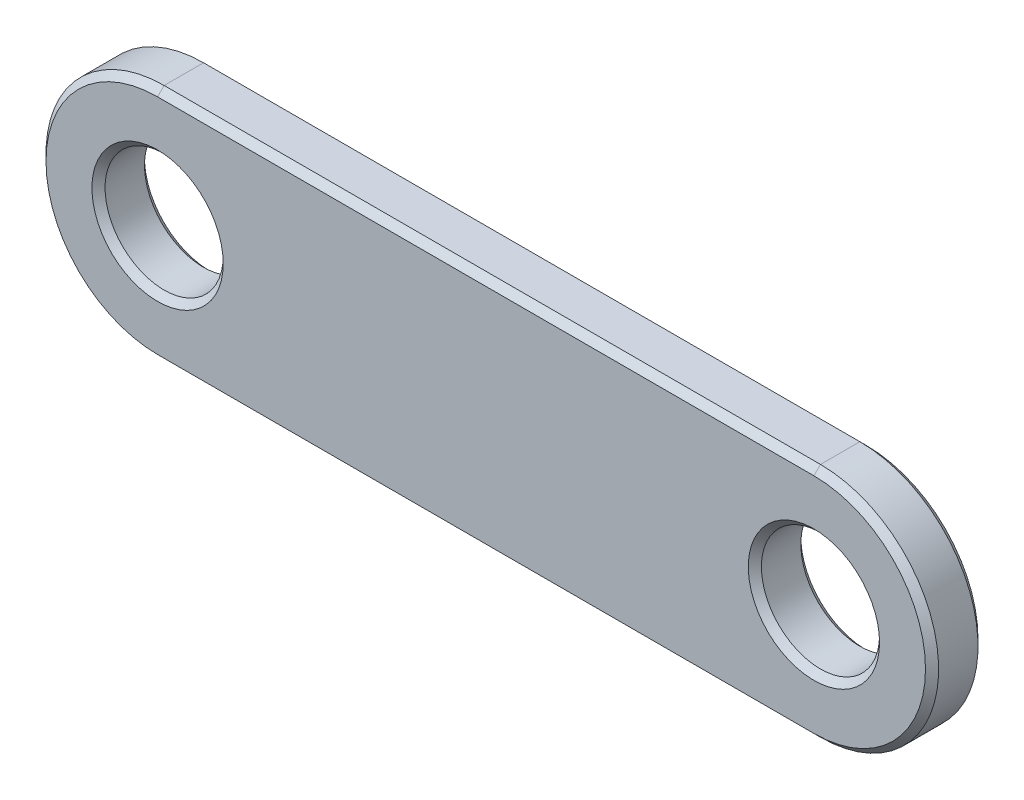
ISO-10303-21;
HEADER;
FILE_DESCRIPTION(('STEP AP214'),'2;1');
FILE_NAME('part.step','',(''),(''),'','','');
FILE_SCHEMA(('AUTOMOTIVE_DESIGN { 1 0 10303 214 1 1 1 1 }'));
ENDSEC;
DATA;
#1=APPLICATION_CONTEXT('core data for automotive mechanical design processes');
#2=APPLICATION_PROTOCOL_DEFINITION('international standard','automotive_design',2000,#1);
#3=PRODUCT_CONTEXT('',#1,'mechanical');
#4=PRODUCT('Part','Part','',(#3));
#5=PRODUCT_RELATED_PRODUCT_CATEGORY('part','',(#4));
#6=PRODUCT_DEFINITION_FORMATION('','',#4);
#7=PRODUCT_DEFINITION_CONTEXT('part definition',#1,'design');
#8=PRODUCT_DEFINITION('design','',#6,#7);
#9=PRODUCT_DEFINITION_SHAPE('','',#8);
#10=(LENGTH_UNIT() NAMED_UNIT(*) SI_UNIT(.MILLI.,.METRE.));
#11=(NAMED_UNIT(*) PLANE_ANGLE_UNIT() SI_UNIT($,.RADIAN.));
#12=(NAMED_UNIT(*) SI_UNIT($,.STERADIAN.) SOLID_ANGLE_UNIT());
#13=UNCERTAINTY_MEASURE_WITH_UNIT(LENGTH_MEASURE(1.E-05),#10,'distance_accuracy_value','');
#14=(GEOMETRIC_REPRESENTATION_CONTEXT(3) GLOBAL_UNCERTAINTY_ASSIGNED_CONTEXT((#13)) GLOBAL_UNIT_ASSIGNED_CONTEXT((#10,
#11,#12)) REPRESENTATION_CONTEXT('',''));
#15=CARTESIAN_POINT('',(0.,0.,0.));
#16=DIRECTION('',(0.,0.,1.));
#17=DIRECTION('',(1.,0.,0.));
#18=AXIS2_PLACEMENT_3D('',#15,#16,#17);
#19=CARTESIAN_POINT('',(-63.5,0.,5.08));
#20=DIRECTION('',(0.,0.,1.));
#21=DIRECTION('',(1.,0.,0.));
#22=AXIS2_PLACEMENT_3D('',#19,#20,#21);
#23=PLANE('',#22);
#24=CARTESIAN_POINT('',(-63.5,0.,5.08));
#25=DIRECTION('',(0.,0.,1.));
#26=DIRECTION('',(1.,0.,0.));
#27=AXIS2_PLACEMENT_3D('',#24,#25,#26);
#28=CIRCLE('',#27,6.34999999999998);
#29=CARTESIAN_POINT('',(-57.15,0.,5.08));
#30=VERTEX_POINT('',#29);
#31=EDGE_CURVE('E11',#30,#30,#28,.F.);
#32=ORIENTED_EDGE('',*,*,#31,.T.);
#33=EDGE_LOOP('',(#32));
#34=FACE_BOUND('',#33,.T.);
#35=CARTESIAN_POINT('',(0.,0.,5.08));
#36=DIRECTION('',(0.,0.,1.));
#37=DIRECTION('',(1.,0.,0.));
#38=AXIS2_PLACEMENT_3D('',#35,#36,#37);
#39=CIRCLE('',#38,10.795);
#40=CARTESIAN_POINT('',(0.,-10.795,5.08));
#41=VERTEX_POINT('',#40);
#42=CARTESIAN_POINT('',(0.,10.795,5.08));
#43=VERTEX_POINT('',#42);
#44=EDGE_CURVE('E51',#41,#43,#39,.T.);
#45=ORIENTED_EDGE('',*,*,#44,.T.);
#46=DIRECTION('',(-1.,0.,0.));
#47=VECTOR('',#46,1.);
#48=CARTESIAN_POINT('',(-63.5,10.795,5.08));
#49=LINE('',#48,#47);
#50=CARTESIAN_POINT('',(-63.5,10.795,5.08));
#51=VERTEX_POINT('',#50);
#52=EDGE_CURVE('E43',#43,#51,#49,.T.);
#53=ORIENTED_EDGE('',*,*,#52,.T.);
#54=CARTESIAN_POINT('',(-63.5,0.,5.08));
#55=DIRECTION('',(0.,0.,1.));
#56=DIRECTION('',(1.,0.,0.));
#57=AXIS2_PLACEMENT_3D('',#54,#55,#56);
#58=CIRCLE('',#57,10.795);
#59=CARTESIAN_POINT('',(-63.5,-10.795,5.08));
#60=VERTEX_POINT('',#59);
#61=EDGE_CURVE('E169',#51,#60,#58,.T.);
#62=ORIENTED_EDGE('',*,*,#61,.T.);
#63=DIRECTION('',(1.,0.,0.));
#64=VECTOR('',#63,1.);
#65=CARTESIAN_POINT('',(0.,-10.795,5.08));
#66=LINE('',#65,#64);
#67=EDGE_CURVE('E56',#60,#41,#66,.T.);
#68=ORIENTED_EDGE('',*,*,#67,.T.);
#69=EDGE_LOOP('',(#45,#53,#62,#68));
#70=FACE_BOUND('',#69,.T.);
#71=CARTESIAN_POINT('',(0.,0.,5.08));
#72=DIRECTION('',(0.,0.,1.));
#73=DIRECTION('',(1.,0.,0.));
#74=AXIS2_PLACEMENT_3D('',#71,#72,#73);
#75=CIRCLE('',#74,6.34999999999998);
#76=CARTESIAN_POINT('',(6.34999999999998,0.,5.08));
#77=VERTEX_POINT('',#76);
#78=EDGE_CURVE('E166',#77,#77,#75,.F.);
#79=ORIENTED_EDGE('',*,*,#78,.T.);
#80=EDGE_LOOP('',(#79));
#81=FACE_BOUND('',#80,.T.);
#82=ADVANCED_FACE('F34',(#34,#70,#81),#23,.T.);
#83=CARTESIAN_POINT('',(-63.5,0.,0.));
#84=DIRECTION('',(0.,0.,1.));
#85=DIRECTION('',(1.,0.,0.));
#86=AXIS2_PLACEMENT_3D('',#83,#84,#85);
#87=PLANE('',#86);
#88=CARTESIAN_POINT('',(-63.5,0.,0.));
#89=DIRECTION('',(0.,0.,1.));
#90=DIRECTION('',(1.,0.,0.));
#91=AXIS2_PLACEMENT_3D('',#88,#89,#90);
#92=CIRCLE('',#91,6.34999999999999);
#93=CARTESIAN_POINT('',(-57.15,0.,0.));
#94=VERTEX_POINT('',#93);
#95=EDGE_CURVE('E131',#94,#94,#92,.T.);
#96=ORIENTED_EDGE('',*,*,#95,.T.);
#97=EDGE_LOOP('',(#96));
#98=FACE_BOUND('',#97,.T.);
#99=CARTESIAN_POINT('',(0.,0.,0.));
#100=DIRECTION('',(0.,0.,1.));
#101=DIRECTION('',(1.,0.,0.));
#102=AXIS2_PLACEMENT_3D('',#99,#100,#101);
#103=CIRCLE('',#102,6.35);
#104=CARTESIAN_POINT('',(6.35,0.,0.));
#105=VERTEX_POINT('',#104);
#106=EDGE_CURVE('E128',#105,#105,#103,.T.);
#107=ORIENTED_EDGE('',*,*,#106,.T.);
#108=EDGE_LOOP('',(#107));
#109=FACE_BOUND('',#108,.T.);
#110=CARTESIAN_POINT('',(0.,0.,0.));
#111=DIRECTION('',(0.,0.,1.));
#112=DIRECTION('',(1.,0.,0.));
#113=AXIS2_PLACEMENT_3D('',#110,#111,#112);
#114=CIRCLE('',#113,10.795);
#115=CARTESIAN_POINT('',(0.,10.795,0.));
#116=VERTEX_POINT('',#115);
#117=CARTESIAN_POINT('',(0.,-10.795,0.));
#118=VERTEX_POINT('',#117);
#119=EDGE_CURVE('E127',#116,#118,#114,.F.);
#120=ORIENTED_EDGE('',*,*,#119,.T.);
#121=DIRECTION('',(-1.,0.,0.));
#122=VECTOR('',#121,1.);
#123=CARTESIAN_POINT('',(-63.5,-10.795,0.));
#124=LINE('',#123,#122);
#125=CARTESIAN_POINT('',(-63.5,-10.795,0.));
#126=VERTEX_POINT('',#125);
#127=EDGE_CURVE('E106',#118,#126,#124,.T.);
#128=ORIENTED_EDGE('',*,*,#127,.T.);
#129=CARTESIAN_POINT('',(-63.5,0.,0.));
#130=DIRECTION('',(0.,0.,1.));
#131=DIRECTION('',(1.,0.,0.));
#132=AXIS2_PLACEMENT_3D('',#129,#130,#131);
#133=CIRCLE('',#132,10.795);
#134=CARTESIAN_POINT('',(-63.5,10.795,0.));
#135=VERTEX_POINT('',#134);
#136=EDGE_CURVE('E116',#126,#135,#133,.F.);
#137=ORIENTED_EDGE('',*,*,#136,.T.);
#138=DIRECTION('',(1.,0.,0.));
#139=VECTOR('',#138,1.);
#140=CARTESIAN_POINT('',(-63.5,10.795,0.));
#141=LINE('',#140,#139);
#142=EDGE_CURVE('E122',#135,#116,#141,.T.);
#143=ORIENTED_EDGE('',*,*,#142,.T.);
#144=EDGE_LOOP('',(#120,#128,#137,#143));
#145=FACE_BOUND('',#144,.T.);
#146=ADVANCED_FACE('F125',(#98,#109,#145),#87,.F.);
#147=CARTESIAN_POINT('',(-63.5,0.,5.08));
#148=DIRECTION('',(0.,0.,-1.));
#149=DIRECTION('',(-1.,0.,0.));
#150=AXIS2_PLACEMENT_3D('',#147,#148,#149);
#151=CYLINDRICAL_SURFACE('',#150,11.43);
#152=DIRECTION('',(0.,0.,-1.));
#153=VECTOR('',#152,1.);
#154=CARTESIAN_POINT('',(-63.5,11.43,5.08));
#155=LINE('',#154,#153);
#156=CARTESIAN_POINT('',(-63.5,11.43,4.44500000000003));
#157=VERTEX_POINT('',#156);
#158=CARTESIAN_POINT('',(-63.5,11.43,0.635000000000009));
#159=VERTEX_POINT('',#158);
#160=EDGE_CURVE('E178',#157,#159,#155,.T.);
#161=ORIENTED_EDGE('',*,*,#160,.T.);
#162=CARTESIAN_POINT('',(-63.5,0.,0.635000000000009));
#163=DIRECTION('',(0.,0.,1.));
#164=DIRECTION('',(1.,0.,0.));
#165=AXIS2_PLACEMENT_3D('',#162,#163,#164);
#166=CIRCLE('',#165,11.43);
#167=CARTESIAN_POINT('',(-63.5,-11.43,0.635000000000009));
#168=VERTEX_POINT('',#167);
#169=EDGE_CURVE('E164',#159,#168,#166,.T.);
#170=ORIENTED_EDGE('',*,*,#169,.T.);
#171=DIRECTION('',(0.,0.,-1.));
#172=VECTOR('',#171,1.);
#173=CARTESIAN_POINT('',(-63.5,-11.43,5.08));
#174=LINE('',#173,#172);
#175=CARTESIAN_POINT('',(-63.5,-11.43,4.44500000000003));
#176=VERTEX_POINT('',#175);
#177=EDGE_CURVE('E123',#176,#168,#174,.T.);
#178=ORIENTED_EDGE('',*,*,#177,.F.);
#179=CARTESIAN_POINT('',(-63.5,0.,4.44500000000003));
#180=DIRECTION('',(0.,0.,1.));
#181=DIRECTION('',(1.,0.,0.));
#182=AXIS2_PLACEMENT_3D('',#179,#180,#181);
#183=CIRCLE('',#182,11.43);
#184=EDGE_CURVE('E162',#176,#157,#183,.F.);
#185=ORIENTED_EDGE('',*,*,#184,.T.);
#186=EDGE_LOOP('',(#161,#170,#178,#185));
#187=FACE_BOUND('',#186,.T.);
#188=ADVANCED_FACE('F204',(#187),#151,.T.);
#189=CARTESIAN_POINT('',(-63.5,-11.43,5.08));
#190=DIRECTION('',(0.,1.,0.));
#191=DIRECTION('',(0.,0.,1.));
#192=AXIS2_PLACEMENT_3D('',#189,#190,#191);
#193=PLANE('',#192);
#194=ORIENTED_EDGE('',*,*,#177,.T.);
#195=DIRECTION('',(1.,0.,0.));
#196=VECTOR('',#195,1.);
#197=CARTESIAN_POINT('',(-63.5,-11.43,0.635000000000009));
#198=LINE('',#197,#196);
#199=CARTESIAN_POINT('',(0.,-11.43,0.635000000000009));
#200=VERTEX_POINT('',#199);
#201=EDGE_CURVE('E109',#168,#200,#198,.T.);
#202=ORIENTED_EDGE('',*,*,#201,.T.);
#203=DIRECTION('',(0.,0.,-1.));
#204=VECTOR('',#203,1.);
#205=CARTESIAN_POINT('',(0.,-11.43,5.08));
#206=LINE('',#205,#204);
#207=CARTESIAN_POINT('',(0.,-11.43,4.44500000000003));
#208=VERTEX_POINT('',#207);
#209=EDGE_CURVE('E201',#208,#200,#206,.T.);
#210=ORIENTED_EDGE('',*,*,#209,.F.);
#211=DIRECTION('',(-1.,0.,0.));
#212=VECTOR('',#211,1.);
#213=CARTESIAN_POINT('',(-63.5,-11.43,4.44500000000003));
#214=LINE('',#213,#212);
#215=EDGE_CURVE('E150',#208,#176,#214,.T.);
#216=ORIENTED_EDGE('',*,*,#215,.T.);
#217=EDGE_LOOP('',(#194,#202,#210,#216));
#218=FACE_BOUND('',#217,.T.);
#219=ADVANCED_FACE('F199',(#218),#193,.F.);
#220=CARTESIAN_POINT('',(0.,0.,5.08));
#221=DIRECTION('',(0.,0.,-1.));
#222=DIRECTION('',(-1.,0.,0.));
#223=AXIS2_PLACEMENT_3D('',#220,#221,#222);
#224=CYLINDRICAL_SURFACE('',#223,11.43);
#225=ORIENTED_EDGE('',*,*,#209,.T.);
#226=CARTESIAN_POINT('',(0.,0.,0.635000000000009));
#227=DIRECTION('',(0.,0.,1.));
#228=DIRECTION('',(1.,0.,0.));
#229=AXIS2_PLACEMENT_3D('',#226,#227,#228);
#230=CIRCLE('',#229,11.43);
#231=CARTESIAN_POINT('',(0.,11.43,0.635000000000009));
#232=VERTEX_POINT('',#231);
#233=EDGE_CURVE('E155',#200,#232,#230,.T.);
#234=ORIENTED_EDGE('',*,*,#233,.T.);
#235=DIRECTION('',(0.,0.,-1.));
#236=VECTOR('',#235,1.);
#237=CARTESIAN_POINT('',(0.,11.43,5.08));
#238=LINE('',#237,#236);
#239=CARTESIAN_POINT('',(0.,11.43,4.44500000000003));
#240=VERTEX_POINT('',#239);
#241=EDGE_CURVE('E207',#240,#232,#238,.T.);
#242=ORIENTED_EDGE('',*,*,#241,.F.);
#243=CARTESIAN_POINT('',(0.,0.,4.44500000000003));
#244=DIRECTION('',(0.,0.,1.));
#245=DIRECTION('',(1.,0.,0.));
#246=AXIS2_PLACEMENT_3D('',#243,#244,#245);
#247=CIRCLE('',#246,11.43);
#248=EDGE_CURVE('E153',#240,#208,#247,.F.);
#249=ORIENTED_EDGE('',*,*,#248,.T.);
#250=EDGE_LOOP('',(#225,#234,#242,#249));
#251=FACE_BOUND('',#250,.T.);
#252=ADVANCED_FACE('F220',(#251),#224,.T.);
#253=CARTESIAN_POINT('',(-63.5,11.43,5.08));
#254=DIRECTION('',(0.,-1.,0.));
#255=DIRECTION('',(0.,0.,-1.));
#256=AXIS2_PLACEMENT_3D('',#253,#254,#255);
#257=PLANE('',#256);
#258=ORIENTED_EDGE('',*,*,#241,.T.);
#259=DIRECTION('',(-1.,0.,0.));
#260=VECTOR('',#259,1.);
#261=CARTESIAN_POINT('',(-63.5,11.43,0.635000000000009));
#262=LINE('',#261,#260);
#263=EDGE_CURVE('E160',#232,#159,#262,.T.);
#264=ORIENTED_EDGE('',*,*,#263,.T.);
#265=ORIENTED_EDGE('',*,*,#160,.F.);
#266=DIRECTION('',(1.,0.,0.));
#267=VECTOR('',#266,1.);
#268=CARTESIAN_POINT('',(0.,11.43,4.44500000000003));
#269=LINE('',#268,#267);
#270=EDGE_CURVE('E157',#157,#240,#269,.T.);
#271=ORIENTED_EDGE('',*,*,#270,.T.);
#272=EDGE_LOOP('',(#258,#264,#265,#271));
#273=FACE_BOUND('',#272,.T.);
#274=ADVANCED_FACE('F224',(#273),#257,.F.);
#275=CARTESIAN_POINT('',(0.,0.,5.08));
#276=DIRECTION('',(0.,0.,-1.));
#277=DIRECTION('',(-1.,0.,0.));
#278=AXIS2_PLACEMENT_3D('',#275,#276,#277);
#279=CYLINDRICAL_SURFACE('',#278,5.715);
#280=CARTESIAN_POINT('',(0.,0.,0.635000000000004));
#281=DIRECTION('',(0.,0.,1.));
#282=DIRECTION('',(1.,0.,0.));
#283=AXIS2_PLACEMENT_3D('',#280,#281,#282);
#284=CIRCLE('',#283,5.715);
#285=CARTESIAN_POINT('',(5.715,0.,0.635000000000004));
#286=VERTEX_POINT('',#285);
#287=EDGE_CURVE('E147',#286,#286,#284,.F.);
#288=ORIENTED_EDGE('',*,*,#287,.T.);
#289=EDGE_LOOP('',(#288));
#290=FACE_BOUND('',#289,.T.);
#291=CARTESIAN_POINT('',(0.,0.,4.44500000000002));
#292=DIRECTION('',(0.,0.,1.));
#293=DIRECTION('',(1.,0.,0.));
#294=AXIS2_PLACEMENT_3D('',#291,#292,#293);
#295=CIRCLE('',#294,5.715);
#296=CARTESIAN_POINT('',(5.715,0.,4.44500000000002));
#297=VERTEX_POINT('',#296);
#298=EDGE_CURVE('E144',#297,#297,#295,.T.);
#299=ORIENTED_EDGE('',*,*,#298,.T.);
#300=EDGE_LOOP('',(#299));
#301=FACE_BOUND('',#300,.T.);
#302=ADVANCED_FACE('F240',(#290,#301),#279,.F.);
#303=CARTESIAN_POINT('',(-63.5,0.,5.08));
#304=DIRECTION('',(0.,0.,-1.));
#305=DIRECTION('',(-1.,0.,0.));
#306=AXIS2_PLACEMENT_3D('',#303,#304,#305);
#307=CYLINDRICAL_SURFACE('',#306,5.71500000000001);
#308=CARTESIAN_POINT('',(-63.5,0.,0.634999999999985));
#309=DIRECTION('',(0.,0.,1.));
#310=DIRECTION('',(1.,0.,0.));
#311=AXIS2_PLACEMENT_3D('',#308,#309,#310);
#312=CIRCLE('',#311,5.71500000000001);
#313=CARTESIAN_POINT('',(-57.785,0.,0.634999999999985));
#314=VERTEX_POINT('',#313);
#315=EDGE_CURVE('E141',#314,#314,#312,.F.);
#316=ORIENTED_EDGE('',*,*,#315,.T.);
#317=EDGE_LOOP('',(#316));
#318=FACE_BOUND('',#317,.T.);
#319=CARTESIAN_POINT('',(-63.5,0.,4.44500000000003));
#320=DIRECTION('',(0.,0.,1.));
#321=DIRECTION('',(1.,0.,0.));
#322=AXIS2_PLACEMENT_3D('',#319,#320,#321);
#323=CIRCLE('',#322,5.71500000000001);
#324=CARTESIAN_POINT('',(-57.785,0.,4.44500000000003));
#325=VERTEX_POINT('',#324);
#326=EDGE_CURVE('E138',#325,#325,#323,.T.);
#327=ORIENTED_EDGE('',*,*,#326,.T.);
#328=EDGE_LOOP('',(#327));
#329=FACE_BOUND('',#328,.T.);
#330=ADVANCED_FACE('F242',(#318,#329),#307,.F.);
#331=CARTESIAN_POINT('',(-63.5,0.,0.));
#332=DIRECTION('',(0.,0.,-1.));
#333=DIRECTION('',(-1.,0.,0.));
#334=AXIS2_PLACEMENT_3D('',#331,#332,#333);
#335=CONICAL_SURFACE('',#334,6.34999999999999,0.78539816339745);
#336=ORIENTED_EDGE('',*,*,#315,.F.);
#337=EDGE_LOOP('',(#336));
#338=FACE_BOUND('',#337,.T.);
#339=ORIENTED_EDGE('',*,*,#95,.F.);
#340=EDGE_LOOP('',(#339));
#341=FACE_BOUND('',#340,.T.);
#342=ADVANCED_FACE('F249',(#338,#341),#335,.F.);
#343=CARTESIAN_POINT('',(0.,0.,0.));
#344=DIRECTION('',(0.,0.,-1.));
#345=DIRECTION('',(-1.,0.,0.));
#346=AXIS2_PLACEMENT_3D('',#343,#344,#345);
#347=CONICAL_SURFACE('',#346,6.35,0.785398163397442);
#348=ORIENTED_EDGE('',*,*,#287,.F.);
#349=EDGE_LOOP('',(#348));
#350=FACE_BOUND('',#349,.T.);
#351=ORIENTED_EDGE('',*,*,#106,.F.);
#352=EDGE_LOOP('',(#351));
#353=FACE_BOUND('',#352,.T.);
#354=ADVANCED_FACE('F265',(#350,#353),#347,.F.);
#355=CARTESIAN_POINT('',(-63.5,11.43,0.635000000000009));
#356=DIRECTION('',(0.,-0.707106781186554,0.707106781186541));
#357=DIRECTION('',(-1.,0.,0.));
#358=AXIS2_PLACEMENT_3D('',#355,#356,#357);
#359=PLANE('',#358);
#360=DIRECTION('',(0.,0.707106781186541,0.707106781186554));
#361=VECTOR('',#360,1.);
#362=CARTESIAN_POINT('',(0.,10.795,0.));
#363=LINE('',#362,#361);
#364=EDGE_CURVE('E112',#116,#232,#363,.T.);
#365=ORIENTED_EDGE('',*,*,#364,.F.);
#366=ORIENTED_EDGE('',*,*,#142,.F.);
#367=DIRECTION('',(0.,-0.707106781186541,-0.707106781186554));
#368=VECTOR('',#367,1.);
#369=CARTESIAN_POINT('',(-63.5,11.43,0.635000000000009));
#370=LINE('',#369,#368);
#371=EDGE_CURVE('E119',#159,#135,#370,.T.);
#372=ORIENTED_EDGE('',*,*,#371,.F.);
#373=ORIENTED_EDGE('',*,*,#263,.F.);
#374=EDGE_LOOP('',(#365,#366,#372,#373));
#375=FACE_BOUND('',#374,.T.);
#376=ADVANCED_FACE('F213',(#375),#359,.F.);
#377=CARTESIAN_POINT('',(-63.5,0.,0.635000000000009));
#378=DIRECTION('',(0.,0.,1.));
#379=DIRECTION('',(1.,0.,0.));
#380=AXIS2_PLACEMENT_3D('',#377,#378,#379);
#381=CONICAL_SURFACE('',#380,11.43,0.785398163397439);
#382=ORIENTED_EDGE('',*,*,#371,.T.);
#383=ORIENTED_EDGE('',*,*,#136,.F.);
#384=DIRECTION('',(0.,0.707106781186541,-0.707106781186554));
#385=VECTOR('',#384,1.);
#386=CARTESIAN_POINT('',(-63.5,-11.43,0.635000000000009));
#387=LINE('',#386,#385);
#388=EDGE_CURVE('E102',#168,#126,#387,.T.);
#389=ORIENTED_EDGE('',*,*,#388,.F.);
#390=ORIENTED_EDGE('',*,*,#169,.F.);
#391=EDGE_LOOP('',(#382,#383,#389,#390));
#392=FACE_BOUND('',#391,.T.);
#393=ADVANCED_FACE('F117',(#392),#381,.T.);
#394=CARTESIAN_POINT('',(0.,0.,0.635000000000009));
#395=DIRECTION('',(0.,0.,1.));
#396=DIRECTION('',(1.,0.,0.));
#397=AXIS2_PLACEMENT_3D('',#394,#395,#396);
#398=CONICAL_SURFACE('',#397,11.43,0.785398163397439);
#399=ORIENTED_EDGE('',*,*,#364,.T.);
#400=ORIENTED_EDGE('',*,*,#233,.F.);
#401=DIRECTION('',(0.,-0.707106781186541,0.707106781186554));
#402=VECTOR('',#401,1.);
#403=CARTESIAN_POINT('',(0.,-10.795,0.));
#404=LINE('',#403,#402);
#405=EDGE_CURVE('E113',#118,#200,#404,.T.);
#406=ORIENTED_EDGE('',*,*,#405,.F.);
#407=ORIENTED_EDGE('',*,*,#119,.F.);
#408=EDGE_LOOP('',(#399,#400,#406,#407));
#409=FACE_BOUND('',#408,.T.);
#410=ADVANCED_FACE('F216',(#409),#398,.T.);
#411=CARTESIAN_POINT('',(-63.5,-11.43,0.635000000000009));
#412=DIRECTION('',(0.,0.707106781186554,0.707106781186541));
#413=DIRECTION('',(1.,0.,0.));
#414=AXIS2_PLACEMENT_3D('',#411,#412,#413);
#415=PLANE('',#414);
#416=ORIENTED_EDGE('',*,*,#388,.T.);
#417=ORIENTED_EDGE('',*,*,#127,.F.);
#418=ORIENTED_EDGE('',*,*,#405,.T.);
#419=ORIENTED_EDGE('',*,*,#201,.F.);
#420=EDGE_LOOP('',(#416,#417,#418,#419));
#421=FACE_BOUND('',#420,.T.);
#422=ADVANCED_FACE('F104',(#421),#415,.F.);
#423=CARTESIAN_POINT('',(-63.5,0.,4.44500000000003));
#424=DIRECTION('',(0.,0.,1.));
#425=DIRECTION('',(1.,0.,0.));
#426=AXIS2_PLACEMENT_3D('',#423,#424,#425);
#427=CONICAL_SURFACE('',#426,5.71500000000001,0.785398163397449);
#428=ORIENTED_EDGE('',*,*,#31,.F.);
#429=EDGE_LOOP('',(#428));
#430=FACE_BOUND('',#429,.T.);
#431=ORIENTED_EDGE('',*,*,#326,.F.);
#432=EDGE_LOOP('',(#431));
#433=FACE_BOUND('',#432,.T.);
#434=ADVANCED_FACE('F272',(#430,#433),#427,.F.);
#435=CARTESIAN_POINT('',(-63.5,-10.795,5.08));
#436=DIRECTION('',(0.,-0.707106781186543,0.707106781186552));
#437=DIRECTION('',(-1.,0.,0.));
#438=AXIS2_PLACEMENT_3D('',#435,#436,#437);
#439=PLANE('',#438);
#440=DIRECTION('',(0.,0.707106781186552,0.707106781186543));
#441=VECTOR('',#440,1.);
#442=CARTESIAN_POINT('',(-63.5,-11.43,4.44500000000003));
#443=LINE('',#442,#441);
#444=EDGE_CURVE('E182',#176,#60,#443,.T.);
#445=ORIENTED_EDGE('',*,*,#444,.F.);
#446=ORIENTED_EDGE('',*,*,#215,.F.);
#447=DIRECTION('',(0.,-0.707106781186552,-0.707106781186543));
#448=VECTOR('',#447,1.);
#449=CARTESIAN_POINT('',(0.,-10.795,5.08));
#450=LINE('',#449,#448);
#451=EDGE_CURVE('E38',#41,#208,#450,.T.);
#452=ORIENTED_EDGE('',*,*,#451,.F.);
#453=ORIENTED_EDGE('',*,*,#67,.F.);
#454=EDGE_LOOP('',(#445,#446,#452,#453));
#455=FACE_BOUND('',#454,.T.);
#456=ADVANCED_FACE('F194',(#455),#439,.T.);
#457=CARTESIAN_POINT('',(0.,0.,5.08));
#458=DIRECTION('',(0.,0.,-1.));
#459=DIRECTION('',(-1.,0.,0.));
#460=AXIS2_PLACEMENT_3D('',#457,#458,#459);
#461=CONICAL_SURFACE('',#460,10.795,0.785398163397455);
#462=ORIENTED_EDGE('',*,*,#451,.T.);
#463=ORIENTED_EDGE('',*,*,#248,.F.);
#464=DIRECTION('',(0.,0.707106781186552,-0.707106781186543));
#465=VECTOR('',#464,1.);
#466=CARTESIAN_POINT('',(0.,10.795,5.08));
#467=LINE('',#466,#465);
#468=EDGE_CURVE('E181',#43,#240,#467,.T.);
#469=ORIENTED_EDGE('',*,*,#468,.F.);
#470=ORIENTED_EDGE('',*,*,#44,.F.);
#471=EDGE_LOOP('',(#462,#463,#469,#470));
#472=FACE_BOUND('',#471,.T.);
#473=ADVANCED_FACE('F191',(#472),#461,.T.);
#474=CARTESIAN_POINT('',(-63.5,0.,5.08));
#475=DIRECTION('',(0.,0.,-1.));
#476=DIRECTION('',(-1.,0.,0.));
#477=AXIS2_PLACEMENT_3D('',#474,#475,#476);
#478=CONICAL_SURFACE('',#477,10.795,0.785398163397455);
#479=ORIENTED_EDGE('',*,*,#444,.T.);
#480=ORIENTED_EDGE('',*,*,#61,.F.);
#481=DIRECTION('',(0.,-0.707106781186552,0.707106781186543));
#482=VECTOR('',#481,1.);
#483=CARTESIAN_POINT('',(-63.5,11.43,4.44500000000003));
#484=LINE('',#483,#482);
#485=EDGE_CURVE('E179',#157,#51,#484,.T.);
#486=ORIENTED_EDGE('',*,*,#485,.F.);
#487=ORIENTED_EDGE('',*,*,#184,.F.);
#488=EDGE_LOOP('',(#479,#480,#486,#487));
#489=FACE_BOUND('',#488,.T.);
#490=ADVANCED_FACE('F229',(#489),#478,.T.);
#491=CARTESIAN_POINT('',(-63.5,10.795,5.08));
#492=DIRECTION('',(0.,0.707106781186543,0.707106781186552));
#493=DIRECTION('',(1.,0.,0.));
#494=AXIS2_PLACEMENT_3D('',#491,#492,#493);
#495=PLANE('',#494);
#496=ORIENTED_EDGE('',*,*,#468,.T.);
#497=ORIENTED_EDGE('',*,*,#270,.F.);
#498=ORIENTED_EDGE('',*,*,#485,.T.);
#499=ORIENTED_EDGE('',*,*,#52,.F.);
#500=EDGE_LOOP('',(#496,#497,#498,#499));
#501=FACE_BOUND('',#500,.T.);
#502=ADVANCED_FACE('F227',(#501),#495,.T.);
#503=CARTESIAN_POINT('',(0.,0.,4.44500000000002));
#504=DIRECTION('',(0.,0.,1.));
#505=DIRECTION('',(1.,0.,0.));
#506=AXIS2_PLACEMENT_3D('',#503,#504,#505);
#507=CONICAL_SURFACE('',#506,5.715,0.785398163397449);
#508=ORIENTED_EDGE('',*,*,#78,.F.);
#509=EDGE_LOOP('',(#508));
#510=FACE_BOUND('',#509,.T.);
#511=ORIENTED_EDGE('',*,*,#298,.F.);
#512=EDGE_LOOP('',(#511));
#513=FACE_BOUND('',#512,.T.);
#514=ADVANCED_FACE('F36',(#510,#513),#507,.F.);
#515=CLOSED_SHELL('',(#82,#146,#188,#219,#252,#274,#302,#330,#342,#354,#376,#393,#410,#422,#434,
#456,#473,#490,#502,#514));
#516=MANIFOLD_SOLID_BREP('B2',#515);
#517=ADVANCED_BREP_SHAPE_REPRESENTATION('',(#18,#516),#14);
#518=SHAPE_DEFINITION_REPRESENTATION(#9,#517);
ENDSEC;
END-ISO-10303-21;
